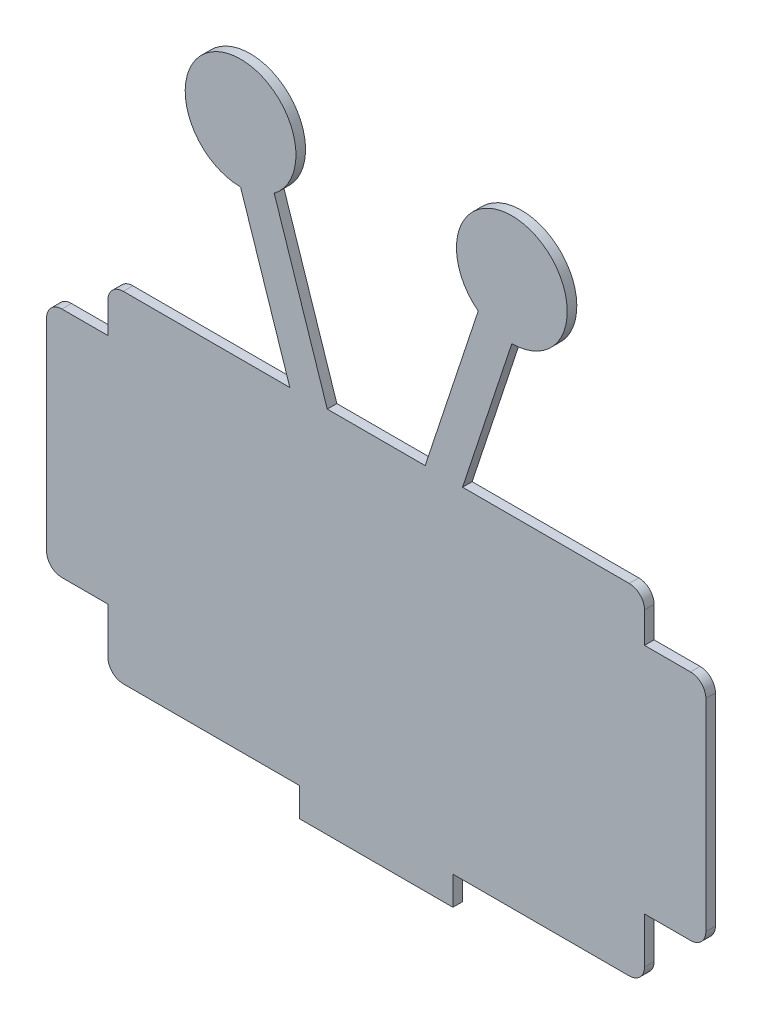
ISO-10303-21;
HEADER;
FILE_DESCRIPTION(('STEP AP214'),'2;1');
FILE_NAME('part.step','',(''),(''),'','','');
FILE_SCHEMA(('AUTOMOTIVE_DESIGN { 1 0 10303 214 1 1 1 1 }'));
ENDSEC;
DATA;
#1=APPLICATION_CONTEXT('core data for automotive mechanical design processes');
#2=APPLICATION_PROTOCOL_DEFINITION('international standard','automotive_design',2000,#1);
#3=PRODUCT_CONTEXT('',#1,'mechanical');
#4=PRODUCT('Part','Part','',(#3));
#5=PRODUCT_RELATED_PRODUCT_CATEGORY('part','',(#4));
#6=PRODUCT_DEFINITION_FORMATION('','',#4);
#7=PRODUCT_DEFINITION_CONTEXT('part definition',#1,'design');
#8=PRODUCT_DEFINITION('design','',#6,#7);
#9=PRODUCT_DEFINITION_SHAPE('','',#8);
#10=(LENGTH_UNIT() NAMED_UNIT(*) SI_UNIT(.MILLI.,.METRE.));
#11=(NAMED_UNIT(*) PLANE_ANGLE_UNIT() SI_UNIT($,.RADIAN.));
#12=(NAMED_UNIT(*) SI_UNIT($,.STERADIAN.) SOLID_ANGLE_UNIT());
#13=UNCERTAINTY_MEASURE_WITH_UNIT(LENGTH_MEASURE(1.E-05),#10,'distance_accuracy_value','');
#14=(GEOMETRIC_REPRESENTATION_CONTEXT(3) GLOBAL_UNCERTAINTY_ASSIGNED_CONTEXT((#13)) GLOBAL_UNIT_ASSIGNED_CONTEXT((#10,
#11,#12)) REPRESENTATION_CONTEXT('',''));
#15=CARTESIAN_POINT('',(0.,0.,0.));
#16=DIRECTION('',(0.,0.,1.));
#17=DIRECTION('',(1.,0.,0.));
#18=AXIS2_PLACEMENT_3D('',#15,#16,#17);
#19=CARTESIAN_POINT('',(-5.08,15.24,3.175));
#20=DIRECTION('',(0.,1.,0.));
#21=DIRECTION('',(-1.,0.,0.));
#22=AXIS2_PLACEMENT_3D('',#19,#20,#21);
#23=PLANE('',#22);
#24=DIRECTION('',(1.,0.,0.));
#25=VECTOR('',#24,1.);
#26=CARTESIAN_POINT('',(-5.08,15.24,0.));
#27=LINE('',#26,#25);
#28=CARTESIAN_POINT('',(-20.32,15.24,0.));
#29=VERTEX_POINT('',#28);
#30=CARTESIAN_POINT('',(-5.08,15.24,0.));
#31=VERTEX_POINT('',#30);
#32=EDGE_CURVE('E284',#29,#31,#27,.T.);
#33=ORIENTED_EDGE('',*,*,#32,.T.);
#34=DIRECTION('',(0.,0.,-1.));
#35=VECTOR('',#34,1.);
#36=CARTESIAN_POINT('',(-5.08,15.24,3.175));
#37=LINE('',#36,#35);
#38=CARTESIAN_POINT('',(-5.08,15.24,3.175));
#39=VERTEX_POINT('',#38);
#40=EDGE_CURVE('E11',#39,#31,#37,.T.);
#41=ORIENTED_EDGE('',*,*,#40,.F.);
#42=DIRECTION('',(1.,0.,0.));
#43=VECTOR('',#42,1.);
#44=CARTESIAN_POINT('',(-5.08,15.24,3.175));
#45=LINE('',#44,#43);
#46=CARTESIAN_POINT('',(-20.32,15.24,3.175));
#47=VERTEX_POINT('',#46);
#48=EDGE_CURVE('E378',#47,#39,#45,.T.);
#49=ORIENTED_EDGE('',*,*,#48,.F.);
#50=DIRECTION('',(0.,0.,-1.));
#51=VECTOR('',#50,1.);
#52=CARTESIAN_POINT('',(-20.32,15.24,3.175));
#53=LINE('',#52,#51);
#54=EDGE_CURVE('E280',#47,#29,#53,.T.);
#55=ORIENTED_EDGE('',*,*,#54,.T.);
#56=EDGE_LOOP('',(#33,#41,#49,#55));
#57=FACE_BOUND('',#56,.T.);
#58=ADVANCED_FACE('F39',(#57),#23,.F.);
#59=CARTESIAN_POINT('',(-5.08,0.,3.175));
#60=DIRECTION('',(1.,0.,0.));
#61=DIRECTION('',(0.,0.,-1.));
#62=AXIS2_PLACEMENT_3D('',#59,#60,#61);
#63=PLANE('',#62);
#64=DIRECTION('',(0.,-1.,0.));
#65=VECTOR('',#64,1.);
#66=CARTESIAN_POINT('',(-5.08,0.,0.));
#67=LINE('',#66,#65);
#68=CARTESIAN_POINT('',(-5.08,0.,0.));
#69=VERTEX_POINT('',#68);
#70=EDGE_CURVE('E288',#31,#69,#67,.T.);
#71=ORIENTED_EDGE('',*,*,#70,.T.);
#72=DIRECTION('',(0.,0.,-1.));
#73=VECTOR('',#72,1.);
#74=CARTESIAN_POINT('',(-5.08,0.,3.175));
#75=LINE('',#74,#73);
#76=CARTESIAN_POINT('',(-5.08,0.,3.175));
#77=VERTEX_POINT('',#76);
#78=EDGE_CURVE('E48',#77,#69,#75,.T.);
#79=ORIENTED_EDGE('',*,*,#78,.F.);
#80=DIRECTION('',(0.,-1.,0.));
#81=VECTOR('',#80,1.);
#82=CARTESIAN_POINT('',(-5.08,0.,3.175));
#83=LINE('',#82,#81);
#84=EDGE_CURVE('E171',#39,#77,#83,.T.);
#85=ORIENTED_EDGE('',*,*,#84,.F.);
#86=ORIENTED_EDGE('',*,*,#40,.T.);
#87=EDGE_LOOP('',(#71,#79,#85,#86));
#88=FACE_BOUND('',#87,.T.);
#89=ADVANCED_FACE('F612',(#88),#63,.F.);
#90=CARTESIAN_POINT('',(0.,0.,3.175));
#91=DIRECTION('',(0.,0.,-1.));
#92=DIRECTION('',(-1.,0.,0.));
#93=AXIS2_PLACEMENT_3D('',#90,#91,#92);
#94=CYLINDRICAL_SURFACE('',#93,5.08);
#95=CARTESIAN_POINT('',(0.,0.,0.));
#96=DIRECTION('',(0.,0.,1.));
#97=DIRECTION('',(-1.,0.,0.));
#98=AXIS2_PLACEMENT_3D('',#95,#96,#97);
#99=CIRCLE('',#98,5.08);
#100=CARTESIAN_POINT('',(0.,-5.08,0.));
#101=VERTEX_POINT('',#100);
#102=EDGE_CURVE('E291',#69,#101,#99,.T.);
#103=ORIENTED_EDGE('',*,*,#102,.T.);
#104=DIRECTION('',(0.,0.,-1.));
#105=VECTOR('',#104,1.);
#106=CARTESIAN_POINT('',(0.,-5.08,3.175));
#107=LINE('',#106,#105);
#108=CARTESIAN_POINT('',(0.,-5.08,3.175));
#109=VERTEX_POINT('',#108);
#110=EDGE_CURVE('E485',#109,#101,#107,.T.);
#111=ORIENTED_EDGE('',*,*,#110,.F.);
#112=CARTESIAN_POINT('',(0.,0.,3.175));
#113=DIRECTION('',(0.,0.,1.));
#114=DIRECTION('',(-1.,0.,0.));
#115=AXIS2_PLACEMENT_3D('',#112,#113,#114);
#116=CIRCLE('',#115,5.08);
#117=EDGE_CURVE('E495',#77,#109,#116,.T.);
#118=ORIENTED_EDGE('',*,*,#117,.F.);
#119=ORIENTED_EDGE('',*,*,#78,.T.);
#120=EDGE_LOOP('',(#103,#111,#118,#119));
#121=FACE_BOUND('',#120,.T.);
#122=ADVANCED_FACE('F493',(#121),#94,.T.);
#123=CARTESIAN_POINT('',(0.,-5.08,3.175));
#124=DIRECTION('',(0.,1.,0.));
#125=DIRECTION('',(0.,0.,1.));
#126=AXIS2_PLACEMENT_3D('',#123,#124,#125);
#127=PLANE('',#126);
#128=DIRECTION('',(1.,0.,0.));
#129=VECTOR('',#128,1.);
#130=CARTESIAN_POINT('',(0.,-5.08,0.));
#131=LINE('',#130,#129);
#132=CARTESIAN_POINT('',(58.42,-5.08,0.));
#133=VERTEX_POINT('',#132);
#134=EDGE_CURVE('E294',#101,#133,#131,.T.);
#135=ORIENTED_EDGE('',*,*,#134,.T.);
#136=DIRECTION('',(0.,0.,-1.));
#137=VECTOR('',#136,1.);
#138=CARTESIAN_POINT('',(58.42,-5.08,3.175));
#139=LINE('',#138,#137);
#140=CARTESIAN_POINT('',(58.42,-5.08,3.175));
#141=VERTEX_POINT('',#140);
#142=EDGE_CURVE('E481',#141,#133,#139,.T.);
#143=ORIENTED_EDGE('',*,*,#142,.F.);
#144=DIRECTION('',(1.,0.,0.));
#145=VECTOR('',#144,1.);
#146=CARTESIAN_POINT('',(0.,-5.08,3.175));
#147=LINE('',#146,#145);
#148=EDGE_CURVE('E514',#109,#141,#147,.T.);
#149=ORIENTED_EDGE('',*,*,#148,.F.);
#150=ORIENTED_EDGE('',*,*,#110,.T.);
#151=EDGE_LOOP('',(#135,#143,#149,#150));
#152=FACE_BOUND('',#151,.T.);
#153=ADVANCED_FACE('F504',(#152),#127,.F.);
#154=CARTESIAN_POINT('',(58.42,-5.08,3.175));
#155=DIRECTION('',(1.,0.,0.));
#156=DIRECTION('',(0.,0.,-1.));
#157=AXIS2_PLACEMENT_3D('',#154,#155,#156);
#158=PLANE('',#157);
#159=DIRECTION('',(0.,-1.,0.));
#160=VECTOR('',#159,1.);
#161=CARTESIAN_POINT('',(58.42,-5.08,0.));
#162=LINE('',#161,#160);
#163=CARTESIAN_POINT('',(58.42,-14.605,0.));
#164=VERTEX_POINT('',#163);
#165=EDGE_CURVE('E297',#133,#164,#162,.T.);
#166=ORIENTED_EDGE('',*,*,#165,.T.);
#167=DIRECTION('',(0.,0.,-1.));
#168=VECTOR('',#167,1.);
#169=CARTESIAN_POINT('',(58.42,-14.605,3.175));
#170=LINE('',#169,#168);
#171=CARTESIAN_POINT('',(58.42,-14.605,3.175));
#172=VERTEX_POINT('',#171);
#173=EDGE_CURVE('E477',#172,#164,#170,.T.);
#174=ORIENTED_EDGE('',*,*,#173,.F.);
#175=DIRECTION('',(0.,-1.,0.));
#176=VECTOR('',#175,1.);
#177=CARTESIAN_POINT('',(58.42,-5.08,3.175));
#178=LINE('',#177,#176);
#179=EDGE_CURVE('E510',#141,#172,#178,.T.);
#180=ORIENTED_EDGE('',*,*,#179,.F.);
#181=ORIENTED_EDGE('',*,*,#142,.T.);
#182=EDGE_LOOP('',(#166,#174,#180,#181));
#183=FACE_BOUND('',#182,.T.);
#184=ADVANCED_FACE('F508',(#183),#158,.F.);
#185=CARTESIAN_POINT('',(58.42,-14.605,3.175));
#186=DIRECTION('',(0.,1.,0.));
#187=DIRECTION('',(0.,0.,1.));
#188=AXIS2_PLACEMENT_3D('',#185,#186,#187);
#189=PLANE('',#188);
#190=DIRECTION('',(1.,0.,0.));
#191=VECTOR('',#190,1.);
#192=CARTESIAN_POINT('',(58.42,-14.605,0.));
#193=LINE('',#192,#191);
#194=CARTESIAN_POINT('',(109.22,-14.605,0.));
#195=VERTEX_POINT('',#194);
#196=EDGE_CURVE('E300',#164,#195,#193,.T.);
#197=ORIENTED_EDGE('',*,*,#196,.T.);
#198=DIRECTION('',(0.,0.,-1.));
#199=VECTOR('',#198,1.);
#200=CARTESIAN_POINT('',(109.22,-14.605,3.175));
#201=LINE('',#200,#199);
#202=CARTESIAN_POINT('',(109.22,-14.605,3.175));
#203=VERTEX_POINT('',#202);
#204=EDGE_CURVE('E473',#203,#195,#201,.T.);
#205=ORIENTED_EDGE('',*,*,#204,.F.);
#206=DIRECTION('',(1.,0.,0.));
#207=VECTOR('',#206,1.);
#208=CARTESIAN_POINT('',(58.42,-14.605,3.175));
#209=LINE('',#208,#207);
#210=EDGE_CURVE('E513',#172,#203,#209,.T.);
#211=ORIENTED_EDGE('',*,*,#210,.F.);
#212=ORIENTED_EDGE('',*,*,#173,.T.);
#213=EDGE_LOOP('',(#197,#205,#211,#212));
#214=FACE_BOUND('',#213,.T.);
#215=ADVANCED_FACE('F625',(#214),#189,.F.);
#216=CARTESIAN_POINT('',(109.22,-5.08,3.175));
#217=DIRECTION('',(-1.,0.,0.));
#218=DIRECTION('',(0.,0.,1.));
#219=AXIS2_PLACEMENT_3D('',#216,#217,#218);
#220=PLANE('',#219);
#221=DIRECTION('',(0.,1.,0.));
#222=VECTOR('',#221,1.);
#223=CARTESIAN_POINT('',(109.22,-5.08,0.));
#224=LINE('',#223,#222);
#225=CARTESIAN_POINT('',(109.22,-5.08,0.));
#226=VERTEX_POINT('',#225);
#227=EDGE_CURVE('E303',#195,#226,#224,.T.);
#228=ORIENTED_EDGE('',*,*,#227,.T.);
#229=DIRECTION('',(0.,0.,-1.));
#230=VECTOR('',#229,1.);
#231=CARTESIAN_POINT('',(109.22,-5.08,3.175));
#232=LINE('',#231,#230);
#233=CARTESIAN_POINT('',(109.22,-5.08,3.175));
#234=VERTEX_POINT('',#233);
#235=EDGE_CURVE('E469',#234,#226,#232,.T.);
#236=ORIENTED_EDGE('',*,*,#235,.F.);
#237=DIRECTION('',(0.,1.,0.));
#238=VECTOR('',#237,1.);
#239=CARTESIAN_POINT('',(109.22,-5.08,3.175));
#240=LINE('',#239,#238);
#241=EDGE_CURVE('E518',#203,#234,#240,.T.);
#242=ORIENTED_EDGE('',*,*,#241,.F.);
#243=ORIENTED_EDGE('',*,*,#204,.T.);
#244=EDGE_LOOP('',(#228,#236,#242,#243));
#245=FACE_BOUND('',#244,.T.);
#246=ADVANCED_FACE('F628',(#245),#220,.F.);
#247=CARTESIAN_POINT('',(109.22,-5.08,3.175));
#248=DIRECTION('',(0.,1.,0.));
#249=DIRECTION('',(0.,0.,1.));
#250=AXIS2_PLACEMENT_3D('',#247,#248,#249);
#251=PLANE('',#250);
#252=DIRECTION('',(1.,0.,0.));
#253=VECTOR('',#252,1.);
#254=CARTESIAN_POINT('',(109.22,-5.08,0.));
#255=LINE('',#254,#253);
#256=CARTESIAN_POINT('',(167.64,-5.08,0.));
#257=VERTEX_POINT('',#256);
#258=EDGE_CURVE('E306',#226,#257,#255,.T.);
#259=ORIENTED_EDGE('',*,*,#258,.T.);
#260=DIRECTION('',(0.,0.,-1.));
#261=VECTOR('',#260,1.);
#262=CARTESIAN_POINT('',(167.64,-5.08,3.175));
#263=LINE('',#262,#261);
#264=CARTESIAN_POINT('',(167.64,-5.08,3.175));
#265=VERTEX_POINT('',#264);
#266=EDGE_CURVE('E465',#265,#257,#263,.T.);
#267=ORIENTED_EDGE('',*,*,#266,.F.);
#268=DIRECTION('',(1.,0.,0.));
#269=VECTOR('',#268,1.);
#270=CARTESIAN_POINT('',(109.22,-5.08,3.175));
#271=LINE('',#270,#269);
#272=EDGE_CURVE('E525',#234,#265,#271,.T.);
#273=ORIENTED_EDGE('',*,*,#272,.F.);
#274=ORIENTED_EDGE('',*,*,#235,.T.);
#275=EDGE_LOOP('',(#259,#267,#273,#274));
#276=FACE_BOUND('',#275,.T.);
#277=ADVANCED_FACE('F632',(#276),#251,.F.);
#278=CARTESIAN_POINT('',(167.64,0.,3.175));
#279=DIRECTION('',(0.,0.,-1.));
#280=DIRECTION('',(-1.,0.,0.));
#281=AXIS2_PLACEMENT_3D('',#278,#279,#280);
#282=CYLINDRICAL_SURFACE('',#281,5.08);
#283=CARTESIAN_POINT('',(167.64,0.,0.));
#284=DIRECTION('',(0.,0.,1.));
#285=DIRECTION('',(1.,0.,0.));
#286=AXIS2_PLACEMENT_3D('',#283,#284,#285);
#287=CIRCLE('',#286,5.08);
#288=CARTESIAN_POINT('',(172.72,0.,0.));
#289=VERTEX_POINT('',#288);
#290=EDGE_CURVE('E309',#257,#289,#287,.T.);
#291=ORIENTED_EDGE('',*,*,#290,.T.);
#292=DIRECTION('',(0.,0.,-1.));
#293=VECTOR('',#292,1.);
#294=CARTESIAN_POINT('',(172.72,0.,3.175));
#295=LINE('',#294,#293);
#296=CARTESIAN_POINT('',(172.72,0.,3.175));
#297=VERTEX_POINT('',#296);
#298=EDGE_CURVE('E461',#297,#289,#295,.T.);
#299=ORIENTED_EDGE('',*,*,#298,.F.);
#300=CARTESIAN_POINT('',(167.64,0.,3.175));
#301=DIRECTION('',(0.,0.,1.));
#302=DIRECTION('',(1.,0.,0.));
#303=AXIS2_PLACEMENT_3D('',#300,#301,#302);
#304=CIRCLE('',#303,5.08);
#305=EDGE_CURVE('E528',#265,#297,#304,.T.);
#306=ORIENTED_EDGE('',*,*,#305,.F.);
#307=ORIENTED_EDGE('',*,*,#266,.T.);
#308=EDGE_LOOP('',(#291,#299,#306,#307));
#309=FACE_BOUND('',#308,.T.);
#310=ADVANCED_FACE('F636',(#309),#282,.T.);
#311=CARTESIAN_POINT('',(172.72,0.,3.175));
#312=DIRECTION('',(-1.,0.,0.));
#313=DIRECTION('',(0.,0.,1.));
#314=AXIS2_PLACEMENT_3D('',#311,#312,#313);
#315=PLANE('',#314);
#316=DIRECTION('',(0.,1.,0.));
#317=VECTOR('',#316,1.);
#318=CARTESIAN_POINT('',(172.72,0.,0.));
#319=LINE('',#318,#317);
#320=CARTESIAN_POINT('',(172.72,15.24,0.));
#321=VERTEX_POINT('',#320);
#322=EDGE_CURVE('E312',#289,#321,#319,.T.);
#323=ORIENTED_EDGE('',*,*,#322,.T.);
#324=DIRECTION('',(0.,0.,-1.));
#325=VECTOR('',#324,1.);
#326=CARTESIAN_POINT('',(172.72,15.24,3.175));
#327=LINE('',#326,#325);
#328=CARTESIAN_POINT('',(172.72,15.24,3.175));
#329=VERTEX_POINT('',#328);
#330=EDGE_CURVE('E457',#329,#321,#327,.T.);
#331=ORIENTED_EDGE('',*,*,#330,.F.);
#332=DIRECTION('',(0.,1.,0.));
#333=VECTOR('',#332,1.);
#334=CARTESIAN_POINT('',(172.72,0.,3.175));
#335=LINE('',#334,#333);
#336=EDGE_CURVE('E531',#297,#329,#335,.T.);
#337=ORIENTED_EDGE('',*,*,#336,.F.);
#338=ORIENTED_EDGE('',*,*,#298,.T.);
#339=EDGE_LOOP('',(#323,#331,#337,#338));
#340=FACE_BOUND('',#339,.T.);
#341=ADVANCED_FACE('F640',(#340),#315,.F.);
#342=CARTESIAN_POINT('',(172.72,15.24,3.175));
#343=DIRECTION('',(0.,1.,0.));
#344=DIRECTION('',(-1.,0.,0.));
#345=AXIS2_PLACEMENT_3D('',#342,#343,#344);
#346=PLANE('',#345);
#347=DIRECTION('',(1.,0.,0.));
#348=VECTOR('',#347,1.);
#349=CARTESIAN_POINT('',(172.72,15.24,0.));
#350=LINE('',#349,#348);
#351=CARTESIAN_POINT('',(187.96,15.24,0.));
#352=VERTEX_POINT('',#351);
#353=EDGE_CURVE('E315',#321,#352,#350,.T.);
#354=ORIENTED_EDGE('',*,*,#353,.T.);
#355=DIRECTION('',(0.,0.,-1.));
#356=VECTOR('',#355,1.);
#357=CARTESIAN_POINT('',(187.96,15.24,3.175));
#358=LINE('',#357,#356);
#359=CARTESIAN_POINT('',(187.96,15.24,3.175));
#360=VERTEX_POINT('',#359);
#361=EDGE_CURVE('E453',#360,#352,#358,.T.);
#362=ORIENTED_EDGE('',*,*,#361,.F.);
#363=DIRECTION('',(1.,0.,0.));
#364=VECTOR('',#363,1.);
#365=CARTESIAN_POINT('',(172.72,15.24,3.175));
#366=LINE('',#365,#364);
#367=EDGE_CURVE('E534',#329,#360,#366,.T.);
#368=ORIENTED_EDGE('',*,*,#367,.F.);
#369=ORIENTED_EDGE('',*,*,#330,.T.);
#370=EDGE_LOOP('',(#354,#362,#368,#369));
#371=FACE_BOUND('',#370,.T.);
#372=ADVANCED_FACE('F644',(#371),#346,.F.);
#373=CARTESIAN_POINT('',(187.96,20.32,3.175));
#374=DIRECTION('',(0.,0.,-1.));
#375=DIRECTION('',(-1.,0.,0.));
#376=AXIS2_PLACEMENT_3D('',#373,#374,#375);
#377=CYLINDRICAL_SURFACE('',#376,5.08);
#378=CARTESIAN_POINT('',(187.96,20.32,0.));
#379=DIRECTION('',(0.,0.,1.));
#380=DIRECTION('',(-1.,0.,0.));
#381=AXIS2_PLACEMENT_3D('',#378,#379,#380);
#382=CIRCLE('',#381,5.08);
#383=CARTESIAN_POINT('',(193.04,20.32,0.));
#384=VERTEX_POINT('',#383);
#385=EDGE_CURVE('E318',#352,#384,#382,.T.);
#386=ORIENTED_EDGE('',*,*,#385,.T.);
#387=DIRECTION('',(0.,0.,-1.));
#388=VECTOR('',#387,1.);
#389=CARTESIAN_POINT('',(193.04,20.32,3.175));
#390=LINE('',#389,#388);
#391=CARTESIAN_POINT('',(193.04,20.32,3.175));
#392=VERTEX_POINT('',#391);
#393=EDGE_CURVE('E449',#392,#384,#390,.T.);
#394=ORIENTED_EDGE('',*,*,#393,.F.);
#395=CARTESIAN_POINT('',(187.96,20.32,3.175));
#396=DIRECTION('',(0.,0.,1.));
#397=DIRECTION('',(-1.,0.,0.));
#398=AXIS2_PLACEMENT_3D('',#395,#396,#397);
#399=CIRCLE('',#398,5.08);
#400=EDGE_CURVE('E537',#360,#392,#399,.T.);
#401=ORIENTED_EDGE('',*,*,#400,.F.);
#402=ORIENTED_EDGE('',*,*,#361,.T.);
#403=EDGE_LOOP('',(#386,#394,#401,#402));
#404=FACE_BOUND('',#403,.T.);
#405=ADVANCED_FACE('F648',(#404),#377,.T.);
#406=CARTESIAN_POINT('',(193.04,20.32,3.175));
#407=DIRECTION('',(-1.,0.,0.));
#408=DIRECTION('',(0.,0.,1.));
#409=AXIS2_PLACEMENT_3D('',#406,#407,#408);
#410=PLANE('',#409);
#411=DIRECTION('',(0.,1.,0.));
#412=VECTOR('',#411,1.);
#413=CARTESIAN_POINT('',(193.04,20.32,0.));
#414=LINE('',#413,#412);
#415=CARTESIAN_POINT('',(193.04,87.2235999999999,0.));
#416=VERTEX_POINT('',#415);
#417=EDGE_CURVE('E321',#384,#416,#414,.T.);
#418=ORIENTED_EDGE('',*,*,#417,.T.);
#419=DIRECTION('',(0.,0.,-1.));
#420=VECTOR('',#419,1.);
#421=CARTESIAN_POINT('',(193.04,87.2235999999999,3.175));
#422=LINE('',#421,#420);
#423=CARTESIAN_POINT('',(193.04,87.2235999999999,3.175));
#424=VERTEX_POINT('',#423);
#425=EDGE_CURVE('E445',#424,#416,#422,.T.);
#426=ORIENTED_EDGE('',*,*,#425,.F.);
#427=DIRECTION('',(0.,1.,0.));
#428=VECTOR('',#427,1.);
#429=CARTESIAN_POINT('',(193.04,20.32,3.175));
#430=LINE('',#429,#428);
#431=EDGE_CURVE('E540',#392,#424,#430,.T.);
#432=ORIENTED_EDGE('',*,*,#431,.F.);
#433=ORIENTED_EDGE('',*,*,#393,.T.);
#434=EDGE_LOOP('',(#418,#426,#432,#433));
#435=FACE_BOUND('',#434,.T.);
#436=ADVANCED_FACE('F652',(#435),#410,.F.);
#437=CARTESIAN_POINT('',(187.96,87.2235999999999,3.175));
#438=DIRECTION('',(0.,0.,-1.));
#439=DIRECTION('',(-1.,0.,0.));
#440=AXIS2_PLACEMENT_3D('',#437,#438,#439);
#441=CYLINDRICAL_SURFACE('',#440,5.07999999999999);
#442=CARTESIAN_POINT('',(187.96,87.2235999999999,0.));
#443=DIRECTION('',(0.,0.,1.));
#444=DIRECTION('',(-1.,0.,0.));
#445=AXIS2_PLACEMENT_3D('',#442,#443,#444);
#446=CIRCLE('',#445,5.07999999999999);
#447=CARTESIAN_POINT('',(187.96,92.3035999999999,0.));
#448=VERTEX_POINT('',#447);
#449=EDGE_CURVE('E324',#416,#448,#446,.T.);
#450=ORIENTED_EDGE('',*,*,#449,.T.);
#451=DIRECTION('',(0.,0.,-1.));
#452=VECTOR('',#451,1.);
#453=CARTESIAN_POINT('',(187.96,92.3035999999999,3.175));
#454=LINE('',#453,#452);
#455=CARTESIAN_POINT('',(187.96,92.3035999999999,3.175));
#456=VERTEX_POINT('',#455);
#457=EDGE_CURVE('E441',#456,#448,#454,.T.);
#458=ORIENTED_EDGE('',*,*,#457,.F.);
#459=CARTESIAN_POINT('',(187.96,87.2235999999999,3.175));
#460=DIRECTION('',(0.,0.,1.));
#461=DIRECTION('',(-1.,0.,0.));
#462=AXIS2_PLACEMENT_3D('',#459,#460,#461);
#463=CIRCLE('',#462,5.07999999999999);
#464=EDGE_CURVE('E543',#424,#456,#463,.T.);
#465=ORIENTED_EDGE('',*,*,#464,.F.);
#466=ORIENTED_EDGE('',*,*,#425,.T.);
#467=EDGE_LOOP('',(#450,#458,#465,#466));
#468=FACE_BOUND('',#467,.T.);
#469=ADVANCED_FACE('F656',(#468),#441,.T.);
#470=CARTESIAN_POINT('',(172.72,92.3035999999999,3.175));
#471=DIRECTION('',(0.,-1.,0.));
#472=DIRECTION('',(1.,0.,0.));
#473=AXIS2_PLACEMENT_3D('',#470,#471,#472);
#474=PLANE('',#473);
#475=DIRECTION('',(-1.,0.,0.));
#476=VECTOR('',#475,1.);
#477=CARTESIAN_POINT('',(172.72,92.3035999999999,0.));
#478=LINE('',#477,#476);
#479=CARTESIAN_POINT('',(172.72,92.3035999999999,0.));
#480=VERTEX_POINT('',#479);
#481=EDGE_CURVE('E327',#448,#480,#478,.T.);
#482=ORIENTED_EDGE('',*,*,#481,.T.);
#483=DIRECTION('',(0.,0.,-1.));
#484=VECTOR('',#483,1.);
#485=CARTESIAN_POINT('',(172.72,92.3035999999999,3.175));
#486=LINE('',#485,#484);
#487=CARTESIAN_POINT('',(172.72,92.3035999999999,3.175));
#488=VERTEX_POINT('',#487);
#489=EDGE_CURVE('E437',#488,#480,#486,.T.);
#490=ORIENTED_EDGE('',*,*,#489,.F.);
#491=DIRECTION('',(-1.,0.,0.));
#492=VECTOR('',#491,1.);
#493=CARTESIAN_POINT('',(172.72,92.3035999999999,3.175));
#494=LINE('',#493,#492);
#495=EDGE_CURVE('E546',#456,#488,#494,.T.);
#496=ORIENTED_EDGE('',*,*,#495,.F.);
#497=ORIENTED_EDGE('',*,*,#457,.T.);
#498=EDGE_LOOP('',(#482,#490,#496,#497));
#499=FACE_BOUND('',#498,.T.);
#500=ADVANCED_FACE('F660',(#499),#474,.F.);
#501=CARTESIAN_POINT('',(172.72,92.3035999999999,3.175));
#502=DIRECTION('',(-1.,0.,0.));
#503=DIRECTION('',(0.,0.,1.));
#504=AXIS2_PLACEMENT_3D('',#501,#502,#503);
#505=PLANE('',#504);
#506=DIRECTION('',(0.,1.,0.));
#507=VECTOR('',#506,1.);
#508=CARTESIAN_POINT('',(172.72,92.3035999999999,0.));
#509=LINE('',#508,#507);
#510=CARTESIAN_POINT('',(172.72,102.4636,0.));
#511=VERTEX_POINT('',#510);
#512=EDGE_CURVE('E330',#480,#511,#509,.T.);
#513=ORIENTED_EDGE('',*,*,#512,.T.);
#514=DIRECTION('',(0.,0.,-1.));
#515=VECTOR('',#514,1.);
#516=CARTESIAN_POINT('',(172.72,102.4636,3.175));
#517=LINE('',#516,#515);
#518=CARTESIAN_POINT('',(172.72,102.4636,3.175));
#519=VERTEX_POINT('',#518);
#520=EDGE_CURVE('E433',#519,#511,#517,.T.);
#521=ORIENTED_EDGE('',*,*,#520,.F.);
#522=DIRECTION('',(0.,1.,0.));
#523=VECTOR('',#522,1.);
#524=CARTESIAN_POINT('',(172.72,92.3035999999999,3.175));
#525=LINE('',#524,#523);
#526=EDGE_CURVE('E549',#488,#519,#525,.T.);
#527=ORIENTED_EDGE('',*,*,#526,.F.);
#528=ORIENTED_EDGE('',*,*,#489,.T.);
#529=EDGE_LOOP('',(#513,#521,#527,#528));
#530=FACE_BOUND('',#529,.T.);
#531=ADVANCED_FACE('F664',(#530),#505,.F.);
#532=CARTESIAN_POINT('',(167.64,102.4636,3.175));
#533=DIRECTION('',(0.,0.,-1.));
#534=DIRECTION('',(-1.,0.,0.));
#535=AXIS2_PLACEMENT_3D('',#532,#533,#534);
#536=CYLINDRICAL_SURFACE('',#535,5.08);
#537=CARTESIAN_POINT('',(167.64,102.4636,0.));
#538=DIRECTION('',(0.,0.,1.));
#539=DIRECTION('',(-1.,0.,0.));
#540=AXIS2_PLACEMENT_3D('',#537,#538,#539);
#541=CIRCLE('',#540,5.08);
#542=CARTESIAN_POINT('',(167.64,107.5436,0.));
#543=VERTEX_POINT('',#542);
#544=EDGE_CURVE('E333',#511,#543,#541,.T.);
#545=ORIENTED_EDGE('',*,*,#544,.T.);
#546=DIRECTION('',(0.,0.,-1.));
#547=VECTOR('',#546,1.);
#548=CARTESIAN_POINT('',(167.64,107.5436,3.175));
#549=LINE('',#548,#547);
#550=CARTESIAN_POINT('',(167.64,107.5436,3.175));
#551=VERTEX_POINT('',#550);
#552=EDGE_CURVE('E429',#551,#543,#549,.T.);
#553=ORIENTED_EDGE('',*,*,#552,.F.);
#554=CARTESIAN_POINT('',(167.64,102.4636,3.175));
#555=DIRECTION('',(0.,0.,1.));
#556=DIRECTION('',(-1.,0.,0.));
#557=AXIS2_PLACEMENT_3D('',#554,#555,#556);
#558=CIRCLE('',#557,5.08);
#559=EDGE_CURVE('E552',#519,#551,#558,.T.);
#560=ORIENTED_EDGE('',*,*,#559,.F.);
#561=ORIENTED_EDGE('',*,*,#520,.T.);
#562=EDGE_LOOP('',(#545,#553,#560,#561));
#563=FACE_BOUND('',#562,.T.);
#564=ADVANCED_FACE('F668',(#563),#536,.T.);
#565=CARTESIAN_POINT('',(112.428072162847,107.5436,3.175));
#566=DIRECTION('',(0.,-1.,0.));
#567=DIRECTION('',(1.,0.,0.));
#568=AXIS2_PLACEMENT_3D('',#565,#566,#567);
#569=PLANE('',#568);
#570=DIRECTION('',(-1.,0.,0.));
#571=VECTOR('',#570,1.);
#572=CARTESIAN_POINT('',(112.428072162847,107.5436,0.));
#573=LINE('',#572,#571);
#574=CARTESIAN_POINT('',(112.428072162847,107.5436,0.));
#575=VERTEX_POINT('',#574);
#576=EDGE_CURVE('E336',#543,#575,#573,.T.);
#577=ORIENTED_EDGE('',*,*,#576,.T.);
#578=DIRECTION('',(0.,0.,-1.));
#579=VECTOR('',#578,1.);
#580=CARTESIAN_POINT('',(112.428072162847,107.5436,3.175));
#581=LINE('',#580,#579);
#582=CARTESIAN_POINT('',(112.428072162847,107.5436,3.175));
#583=VERTEX_POINT('',#582);
#584=EDGE_CURVE('E425',#583,#575,#581,.T.);
#585=ORIENTED_EDGE('',*,*,#584,.F.);
#586=DIRECTION('',(-1.,0.,0.));
#587=VECTOR('',#586,1.);
#588=CARTESIAN_POINT('',(112.428072162847,107.5436,3.175));
#589=LINE('',#588,#587);
#590=EDGE_CURVE('E555',#551,#583,#589,.T.);
#591=ORIENTED_EDGE('',*,*,#590,.F.);
#592=ORIENTED_EDGE('',*,*,#552,.T.);
#593=EDGE_LOOP('',(#577,#585,#591,#592));
#594=FACE_BOUND('',#593,.T.);
#595=ADVANCED_FACE('F672',(#594),#569,.F.);
#596=CARTESIAN_POINT('',(112.428072162847,107.5436,3.175));
#597=DIRECTION('',(-0.949392381169607,0.314092512768298,0.));
#598=DIRECTION('',(-0.314092512768299,-0.949392381169607,0.));
#599=AXIS2_PLACEMENT_3D('',#596,#597,#598);
#600=PLANE('',#599);
#601=DIRECTION('',(0.314092512768299,0.949392381169607,0.));
#602=VECTOR('',#601,1.);
#603=CARTESIAN_POINT('',(112.428072162847,107.5436,0.));
#604=LINE('',#603,#602);
#605=CARTESIAN_POINT('',(128.760921921537,156.912121990611,0.));
#606=VERTEX_POINT('',#605);
#607=EDGE_CURVE('E339',#575,#606,#604,.T.);
#608=ORIENTED_EDGE('',*,*,#607,.T.);
#609=DIRECTION('',(0.,0.,-1.));
#610=VECTOR('',#609,1.);
#611=CARTESIAN_POINT('',(128.760921921537,156.912121990611,3.175));
#612=LINE('',#611,#610);
#613=CARTESIAN_POINT('',(128.760921921537,156.912121990611,3.175));
#614=VERTEX_POINT('',#613);
#615=EDGE_CURVE('E421',#614,#606,#612,.T.);
#616=ORIENTED_EDGE('',*,*,#615,.F.);
#617=DIRECTION('',(0.314092512768299,0.949392381169607,0.));
#618=VECTOR('',#617,1.);
#619=CARTESIAN_POINT('',(112.428072162847,107.5436,3.175));
#620=LINE('',#619,#618);
#621=EDGE_CURVE('E558',#583,#614,#620,.T.);
#622=ORIENTED_EDGE('',*,*,#621,.F.);
#623=ORIENTED_EDGE('',*,*,#584,.T.);
#624=EDGE_LOOP('',(#608,#616,#622,#623));
#625=FACE_BOUND('',#624,.T.);
#626=ADVANCED_FACE('F676',(#625),#600,.F.);
#627=CARTESIAN_POINT('',(128.760921921537,175.262755436898,3.175));
#628=DIRECTION('',(0.,0.,-1.));
#629=DIRECTION('',(-1.,0.,0.));
#630=AXIS2_PLACEMENT_3D('',#627,#628,#629);
#631=CYLINDRICAL_SURFACE('',#630,18.3506334462866);
#632=CARTESIAN_POINT('',(128.760921921537,175.262755436898,0.));
#633=DIRECTION('',(0.,0.,1.));
#634=DIRECTION('',(-1.,0.,0.));
#635=AXIS2_PLACEMENT_3D('',#632,#633,#634);
#636=CIRCLE('',#635,18.3506334462866);
#637=CARTESIAN_POINT('',(117.613615034572,160.685948617577,0.));
#638=VERTEX_POINT('',#637);
#639=EDGE_CURVE('E342',#606,#638,#636,.T.);
#640=ORIENTED_EDGE('',*,*,#639,.T.);
#641=DIRECTION('',(0.,0.,-1.));
#642=VECTOR('',#641,1.);
#643=CARTESIAN_POINT('',(117.613615034572,160.685948617577,3.175));
#644=LINE('',#643,#642);
#645=CARTESIAN_POINT('',(117.613615034572,160.685948617577,3.175));
#646=VERTEX_POINT('',#645);
#647=EDGE_CURVE('E417',#646,#638,#644,.T.);
#648=ORIENTED_EDGE('',*,*,#647,.F.);
#649=CARTESIAN_POINT('',(128.760921921537,175.262755436898,3.175));
#650=DIRECTION('',(0.,0.,1.));
#651=DIRECTION('',(-1.,0.,0.));
#652=AXIS2_PLACEMENT_3D('',#649,#650,#651);
#653=CIRCLE('',#652,18.3506334462866);
#654=EDGE_CURVE('E561',#614,#646,#653,.T.);
#655=ORIENTED_EDGE('',*,*,#654,.F.);
#656=ORIENTED_EDGE('',*,*,#615,.T.);
#657=EDGE_LOOP('',(#640,#648,#655,#656));
#658=FACE_BOUND('',#657,.T.);
#659=ADVANCED_FACE('F680',(#658),#631,.T.);
#660=CARTESIAN_POINT('',(100.032250213485,107.5436,3.175));
#661=DIRECTION('',(0.949392381169607,-0.314092512768298,0.));
#662=DIRECTION('',(0.314092512768299,0.949392381169607,0.));
#663=AXIS2_PLACEMENT_3D('',#660,#661,#662);
#664=PLANE('',#663);
#665=DIRECTION('',(-0.314092512768299,-0.949392381169607,0.));
#666=VECTOR('',#665,1.);
#667=CARTESIAN_POINT('',(100.032250213485,107.5436,0.));
#668=LINE('',#667,#666);
#669=CARTESIAN_POINT('',(100.032250213485,107.5436,0.));
#670=VERTEX_POINT('',#669);
#671=EDGE_CURVE('E345',#638,#670,#668,.T.);
#672=ORIENTED_EDGE('',*,*,#671,.T.);
#673=DIRECTION('',(0.,0.,-1.));
#674=VECTOR('',#673,1.);
#675=CARTESIAN_POINT('',(100.032250213485,107.5436,3.175));
#676=LINE('',#675,#674);
#677=CARTESIAN_POINT('',(100.032250213485,107.5436,3.175));
#678=VERTEX_POINT('',#677);
#679=EDGE_CURVE('E413',#678,#670,#676,.T.);
#680=ORIENTED_EDGE('',*,*,#679,.F.);
#681=DIRECTION('',(-0.314092512768299,-0.949392381169607,0.));
#682=VECTOR('',#681,1.);
#683=CARTESIAN_POINT('',(100.032250213485,107.5436,3.175));
#684=LINE('',#683,#682);
#685=EDGE_CURVE('E564',#646,#678,#684,.T.);
#686=ORIENTED_EDGE('',*,*,#685,.F.);
#687=ORIENTED_EDGE('',*,*,#647,.T.);
#688=EDGE_LOOP('',(#672,#680,#686,#687));
#689=FACE_BOUND('',#688,.T.);
#690=ADVANCED_FACE('F684',(#689),#664,.F.);
#691=CARTESIAN_POINT('',(67.6077497865152,107.5436,3.175));
#692=DIRECTION('',(0.,-1.,0.));
#693=DIRECTION('',(1.,0.,0.));
#694=AXIS2_PLACEMENT_3D('',#691,#692,#693);
#695=PLANE('',#694);
#696=DIRECTION('',(-1.,0.,0.));
#697=VECTOR('',#696,1.);
#698=CARTESIAN_POINT('',(67.6077497865152,107.5436,0.));
#699=LINE('',#698,#697);
#700=CARTESIAN_POINT('',(67.6077497865152,107.5436,0.));
#701=VERTEX_POINT('',#700);
#702=EDGE_CURVE('E348',#670,#701,#699,.T.);
#703=ORIENTED_EDGE('',*,*,#702,.T.);
#704=DIRECTION('',(0.,0.,-1.));
#705=VECTOR('',#704,1.);
#706=CARTESIAN_POINT('',(67.6077497865152,107.5436,3.175));
#707=LINE('',#706,#705);
#708=CARTESIAN_POINT('',(67.6077497865152,107.5436,3.175));
#709=VERTEX_POINT('',#708);
#710=EDGE_CURVE('E409',#709,#701,#707,.T.);
#711=ORIENTED_EDGE('',*,*,#710,.F.);
#712=DIRECTION('',(-1.,0.,0.));
#713=VECTOR('',#712,1.);
#714=CARTESIAN_POINT('',(67.6077497865152,107.5436,3.175));
#715=LINE('',#714,#713);
#716=EDGE_CURVE('E567',#678,#709,#715,.T.);
#717=ORIENTED_EDGE('',*,*,#716,.F.);
#718=ORIENTED_EDGE('',*,*,#679,.T.);
#719=EDGE_LOOP('',(#703,#711,#717,#718));
#720=FACE_BOUND('',#719,.T.);
#721=ADVANCED_FACE('F688',(#720),#695,.F.);
#722=CARTESIAN_POINT('',(67.6077497865152,107.5436,3.175));
#723=DIRECTION('',(-0.949392381169607,-0.314092512768298,0.));
#724=DIRECTION('',(0.314092512768298,-0.949392381169607,0.));
#725=AXIS2_PLACEMENT_3D('',#722,#723,#724);
#726=PLANE('',#725);
#727=DIRECTION('',(-0.314092512768298,0.949392381169607,0.));
#728=VECTOR('',#727,1.);
#729=CARTESIAN_POINT('',(67.6077497865152,107.5436,0.));
#730=LINE('',#729,#728);
#731=CARTESIAN_POINT('',(50.0263849654278,160.685948617577,0.));
#732=VERTEX_POINT('',#731);
#733=EDGE_CURVE('E351',#701,#732,#730,.T.);
#734=ORIENTED_EDGE('',*,*,#733,.T.);
#735=DIRECTION('',(0.,0.,-1.));
#736=VECTOR('',#735,1.);
#737=CARTESIAN_POINT('',(50.0263849654278,160.685948617577,3.175));
#738=LINE('',#737,#736);
#739=CARTESIAN_POINT('',(50.0263849654278,160.685948617577,3.175));
#740=VERTEX_POINT('',#739);
#741=EDGE_CURVE('E405',#740,#732,#738,.T.);
#742=ORIENTED_EDGE('',*,*,#741,.F.);
#743=DIRECTION('',(-0.314092512768298,0.949392381169607,0.));
#744=VECTOR('',#743,1.);
#745=CARTESIAN_POINT('',(67.6077497865152,107.5436,3.175));
#746=LINE('',#745,#744);
#747=EDGE_CURVE('E570',#709,#740,#746,.T.);
#748=ORIENTED_EDGE('',*,*,#747,.F.);
#749=ORIENTED_EDGE('',*,*,#710,.T.);
#750=EDGE_LOOP('',(#734,#742,#748,#749));
#751=FACE_BOUND('',#750,.T.);
#752=ADVANCED_FACE('F692',(#751),#726,.F.);
#753=CARTESIAN_POINT('',(38.879078078463,175.262755436898,3.175));
#754=DIRECTION('',(0.,0.,-1.));
#755=DIRECTION('',(-1.,0.,0.));
#756=AXIS2_PLACEMENT_3D('',#753,#754,#755);
#757=CYLINDRICAL_SURFACE('',#756,18.3506334462866);
#758=CARTESIAN_POINT('',(38.879078078463,175.262755436898,0.));
#759=DIRECTION('',(0.,0.,1.));
#760=DIRECTION('',(1.,0.,0.));
#761=AXIS2_PLACEMENT_3D('',#758,#759,#760);
#762=CIRCLE('',#761,18.3506334462866);
#763=CARTESIAN_POINT('',(38.879078078463,156.912121990612,0.));
#764=VERTEX_POINT('',#763);
#765=EDGE_CURVE('E354',#732,#764,#762,.T.);
#766=ORIENTED_EDGE('',*,*,#765,.T.);
#767=DIRECTION('',(0.,0.,-1.));
#768=VECTOR('',#767,1.);
#769=CARTESIAN_POINT('',(38.879078078463,156.912121990612,3.175));
#770=LINE('',#769,#768);
#771=CARTESIAN_POINT('',(38.879078078463,156.912121990612,3.175));
#772=VERTEX_POINT('',#771);
#773=EDGE_CURVE('E401',#772,#764,#770,.T.);
#774=ORIENTED_EDGE('',*,*,#773,.F.);
#775=CARTESIAN_POINT('',(38.879078078463,175.262755436898,3.175));
#776=DIRECTION('',(0.,0.,1.));
#777=DIRECTION('',(1.,0.,0.));
#778=AXIS2_PLACEMENT_3D('',#775,#776,#777);
#779=CIRCLE('',#778,18.3506334462866);
#780=EDGE_CURVE('E573',#740,#772,#779,.T.);
#781=ORIENTED_EDGE('',*,*,#780,.F.);
#782=ORIENTED_EDGE('',*,*,#741,.T.);
#783=EDGE_LOOP('',(#766,#774,#781,#782));
#784=FACE_BOUND('',#783,.T.);
#785=ADVANCED_FACE('F696',(#784),#757,.T.);
#786=CARTESIAN_POINT('',(55.2119278371531,107.5436,3.175));
#787=DIRECTION('',(0.949392381169607,0.314092512768298,0.));
#788=DIRECTION('',(-0.314092512768298,0.949392381169607,0.));
#789=AXIS2_PLACEMENT_3D('',#786,#787,#788);
#790=PLANE('',#789);
#791=DIRECTION('',(0.314092512768298,-0.949392381169607,0.));
#792=VECTOR('',#791,1.);
#793=CARTESIAN_POINT('',(55.2119278371531,107.5436,0.));
#794=LINE('',#793,#792);
#795=CARTESIAN_POINT('',(55.2119278371531,107.5436,0.));
#796=VERTEX_POINT('',#795);
#797=EDGE_CURVE('E357',#764,#796,#794,.T.);
#798=ORIENTED_EDGE('',*,*,#797,.T.);
#799=DIRECTION('',(0.,0.,-1.));
#800=VECTOR('',#799,1.);
#801=CARTESIAN_POINT('',(55.2119278371531,107.5436,3.175));
#802=LINE('',#801,#800);
#803=CARTESIAN_POINT('',(55.2119278371531,107.5436,3.175));
#804=VERTEX_POINT('',#803);
#805=EDGE_CURVE('E397',#804,#796,#802,.T.);
#806=ORIENTED_EDGE('',*,*,#805,.F.);
#807=DIRECTION('',(0.314092512768298,-0.949392381169607,0.));
#808=VECTOR('',#807,1.);
#809=CARTESIAN_POINT('',(55.2119278371531,107.5436,3.175));
#810=LINE('',#809,#808);
#811=EDGE_CURVE('E576',#772,#804,#810,.T.);
#812=ORIENTED_EDGE('',*,*,#811,.F.);
#813=ORIENTED_EDGE('',*,*,#773,.T.);
#814=EDGE_LOOP('',(#798,#806,#812,#813));
#815=FACE_BOUND('',#814,.T.);
#816=ADVANCED_FACE('F700',(#815),#790,.F.);
#817=CARTESIAN_POINT('',(0.,107.5436,3.175));
#818=DIRECTION('',(0.,-1.,0.));
#819=DIRECTION('',(0.,0.,-1.));
#820=AXIS2_PLACEMENT_3D('',#817,#818,#819);
#821=PLANE('',#820);
#822=DIRECTION('',(-1.,0.,0.));
#823=VECTOR('',#822,1.);
#824=CARTESIAN_POINT('',(0.,107.5436,0.));
#825=LINE('',#824,#823);
#826=CARTESIAN_POINT('',(0.,107.5436,0.));
#827=VERTEX_POINT('',#826);
#828=EDGE_CURVE('E360',#796,#827,#825,.T.);
#829=ORIENTED_EDGE('',*,*,#828,.T.);
#830=DIRECTION('',(0.,0.,-1.));
#831=VECTOR('',#830,1.);
#832=CARTESIAN_POINT('',(0.,107.5436,3.175));
#833=LINE('',#832,#831);
#834=CARTESIAN_POINT('',(0.,107.5436,3.175));
#835=VERTEX_POINT('',#834);
#836=EDGE_CURVE('E393',#835,#827,#833,.T.);
#837=ORIENTED_EDGE('',*,*,#836,.F.);
#838=DIRECTION('',(-1.,0.,0.));
#839=VECTOR('',#838,1.);
#840=CARTESIAN_POINT('',(0.,107.5436,3.175));
#841=LINE('',#840,#839);
#842=EDGE_CURVE('E579',#804,#835,#841,.T.);
#843=ORIENTED_EDGE('',*,*,#842,.F.);
#844=ORIENTED_EDGE('',*,*,#805,.T.);
#845=EDGE_LOOP('',(#829,#837,#843,#844));
#846=FACE_BOUND('',#845,.T.);
#847=ADVANCED_FACE('F704',(#846),#821,.F.);
#848=CARTESIAN_POINT('',(0.,102.4636,3.175));
#849=DIRECTION('',(0.,0.,-1.));
#850=DIRECTION('',(-1.,0.,0.));
#851=AXIS2_PLACEMENT_3D('',#848,#849,#850);
#852=CYLINDRICAL_SURFACE('',#851,5.08);
#853=CARTESIAN_POINT('',(0.,102.4636,0.));
#854=DIRECTION('',(0.,0.,1.));
#855=DIRECTION('',(1.,0.,0.));
#856=AXIS2_PLACEMENT_3D('',#853,#854,#855);
#857=CIRCLE('',#856,5.08);
#858=CARTESIAN_POINT('',(-5.08,102.4636,0.));
#859=VERTEX_POINT('',#858);
#860=EDGE_CURVE('E363',#827,#859,#857,.T.);
#861=ORIENTED_EDGE('',*,*,#860,.T.);
#862=DIRECTION('',(0.,0.,-1.));
#863=VECTOR('',#862,1.);
#864=CARTESIAN_POINT('',(-5.08,102.4636,3.175));
#865=LINE('',#864,#863);
#866=CARTESIAN_POINT('',(-5.08,102.4636,3.175));
#867=VERTEX_POINT('',#866);
#868=EDGE_CURVE('E389',#867,#859,#865,.T.);
#869=ORIENTED_EDGE('',*,*,#868,.F.);
#870=CARTESIAN_POINT('',(0.,102.4636,3.175));
#871=DIRECTION('',(0.,0.,1.));
#872=DIRECTION('',(1.,0.,0.));
#873=AXIS2_PLACEMENT_3D('',#870,#871,#872);
#874=CIRCLE('',#873,5.08);
#875=EDGE_CURVE('E582',#835,#867,#874,.T.);
#876=ORIENTED_EDGE('',*,*,#875,.F.);
#877=ORIENTED_EDGE('',*,*,#836,.T.);
#878=EDGE_LOOP('',(#861,#869,#876,#877));
#879=FACE_BOUND('',#878,.T.);
#880=ADVANCED_FACE('F708',(#879),#852,.T.);
#881=CARTESIAN_POINT('',(-5.08,92.3036,3.175));
#882=DIRECTION('',(1.,0.,0.));
#883=DIRECTION('',(0.,0.,-1.));
#884=AXIS2_PLACEMENT_3D('',#881,#882,#883);
#885=PLANE('',#884);
#886=DIRECTION('',(0.,-1.,0.));
#887=VECTOR('',#886,1.);
#888=CARTESIAN_POINT('',(-5.08,92.3036,0.));
#889=LINE('',#888,#887);
#890=CARTESIAN_POINT('',(-5.08,92.3036,0.));
#891=VERTEX_POINT('',#890);
#892=EDGE_CURVE('E366',#859,#891,#889,.T.);
#893=ORIENTED_EDGE('',*,*,#892,.T.);
#894=DIRECTION('',(0.,0.,-1.));
#895=VECTOR('',#894,1.);
#896=CARTESIAN_POINT('',(-5.08,92.3036,3.175));
#897=LINE('',#896,#895);
#898=CARTESIAN_POINT('',(-5.08,92.3036,3.175));
#899=VERTEX_POINT('',#898);
#900=EDGE_CURVE('E385',#899,#891,#897,.T.);
#901=ORIENTED_EDGE('',*,*,#900,.F.);
#902=DIRECTION('',(0.,-1.,0.));
#903=VECTOR('',#902,1.);
#904=CARTESIAN_POINT('',(-5.08,92.3036,3.175));
#905=LINE('',#904,#903);
#906=EDGE_CURVE('E585',#867,#899,#905,.T.);
#907=ORIENTED_EDGE('',*,*,#906,.F.);
#908=ORIENTED_EDGE('',*,*,#868,.T.);
#909=EDGE_LOOP('',(#893,#901,#907,#908));
#910=FACE_BOUND('',#909,.T.);
#911=ADVANCED_FACE('F593',(#910),#885,.F.);
#912=CARTESIAN_POINT('',(-5.08,92.3036,3.175));
#913=DIRECTION('',(0.,-1.,0.));
#914=DIRECTION('',(1.,0.,0.));
#915=AXIS2_PLACEMENT_3D('',#912,#913,#914);
#916=PLANE('',#915);
#917=DIRECTION('',(-1.,0.,0.));
#918=VECTOR('',#917,1.);
#919=CARTESIAN_POINT('',(-5.08,92.3036,0.));
#920=LINE('',#919,#918);
#921=CARTESIAN_POINT('',(-20.32,92.3036,0.));
#922=VERTEX_POINT('',#921);
#923=EDGE_CURVE('E369',#891,#922,#920,.T.);
#924=ORIENTED_EDGE('',*,*,#923,.T.);
#925=DIRECTION('',(0.,0.,-1.));
#926=VECTOR('',#925,1.);
#927=CARTESIAN_POINT('',(-20.32,92.3036,3.175));
#928=LINE('',#927,#926);
#929=CARTESIAN_POINT('',(-20.32,92.3036,3.175));
#930=VERTEX_POINT('',#929);
#931=EDGE_CURVE('E273',#930,#922,#928,.T.);
#932=ORIENTED_EDGE('',*,*,#931,.F.);
#933=DIRECTION('',(-1.,0.,0.));
#934=VECTOR('',#933,1.);
#935=CARTESIAN_POINT('',(-5.08,92.3036,3.175));
#936=LINE('',#935,#934);
#937=EDGE_CURVE('E262',#899,#930,#936,.T.);
#938=ORIENTED_EDGE('',*,*,#937,.F.);
#939=ORIENTED_EDGE('',*,*,#900,.T.);
#940=EDGE_LOOP('',(#924,#932,#938,#939));
#941=FACE_BOUND('',#940,.T.);
#942=ADVANCED_FACE('F597',(#941),#916,.F.);
#943=CARTESIAN_POINT('',(-20.32,87.2236,3.175));
#944=DIRECTION('',(0.,0.,-1.));
#945=DIRECTION('',(-1.,0.,0.));
#946=AXIS2_PLACEMENT_3D('',#943,#944,#945);
#947=CYLINDRICAL_SURFACE('',#946,5.08);
#948=CARTESIAN_POINT('',(-20.32,87.2236,0.));
#949=DIRECTION('',(0.,0.,1.));
#950=DIRECTION('',(1.,0.,0.));
#951=AXIS2_PLACEMENT_3D('',#948,#949,#950);
#952=CIRCLE('',#951,5.08);
#953=CARTESIAN_POINT('',(-25.4,87.2236,0.));
#954=VERTEX_POINT('',#953);
#955=EDGE_CURVE('E271',#922,#954,#952,.T.);
#956=ORIENTED_EDGE('',*,*,#955,.T.);
#957=DIRECTION('',(0.,0.,-1.));
#958=VECTOR('',#957,1.);
#959=CARTESIAN_POINT('',(-25.4,87.2236,3.175));
#960=LINE('',#959,#958);
#961=CARTESIAN_POINT('',(-25.4,87.2236,3.175));
#962=VERTEX_POINT('',#961);
#963=EDGE_CURVE('E268',#962,#954,#960,.T.);
#964=ORIENTED_EDGE('',*,*,#963,.F.);
#965=CARTESIAN_POINT('',(-20.32,87.2236,3.175));
#966=DIRECTION('',(0.,0.,1.));
#967=DIRECTION('',(1.,0.,0.));
#968=AXIS2_PLACEMENT_3D('',#965,#966,#967);
#969=CIRCLE('',#968,5.08);
#970=EDGE_CURVE('E256',#930,#962,#969,.T.);
#971=ORIENTED_EDGE('',*,*,#970,.F.);
#972=ORIENTED_EDGE('',*,*,#931,.T.);
#973=EDGE_LOOP('',(#956,#964,#971,#972));
#974=FACE_BOUND('',#973,.T.);
#975=ADVANCED_FACE('F269',(#974),#947,.T.);
#976=CARTESIAN_POINT('',(-25.4,20.32,3.175));
#977=DIRECTION('',(1.,0.,0.));
#978=DIRECTION('',(0.,1.,0.));
#979=AXIS2_PLACEMENT_3D('',#976,#977,#978);
#980=PLANE('',#979);
#981=DIRECTION('',(0.,-1.,0.));
#982=VECTOR('',#981,1.);
#983=CARTESIAN_POINT('',(-25.4,20.32,0.));
#984=LINE('',#983,#982);
#985=CARTESIAN_POINT('',(-25.4,20.32,0.));
#986=VERTEX_POINT('',#985);
#987=EDGE_CURVE('E157',#954,#986,#984,.T.);
#988=ORIENTED_EDGE('',*,*,#987,.T.);
#989=DIRECTION('',(0.,0.,-1.));
#990=VECTOR('',#989,1.);
#991=CARTESIAN_POINT('',(-25.4,20.32,3.175));
#992=LINE('',#991,#990);
#993=CARTESIAN_POINT('',(-25.4,20.32,3.175));
#994=VERTEX_POINT('',#993);
#995=EDGE_CURVE('E274',#994,#986,#992,.T.);
#996=ORIENTED_EDGE('',*,*,#995,.F.);
#997=DIRECTION('',(0.,-1.,0.));
#998=VECTOR('',#997,1.);
#999=CARTESIAN_POINT('',(-25.4,20.32,3.175));
#1000=LINE('',#999,#998);
#1001=EDGE_CURVE('E260',#962,#994,#1000,.T.);
#1002=ORIENTED_EDGE('',*,*,#1001,.F.);
#1003=ORIENTED_EDGE('',*,*,#963,.T.);
#1004=EDGE_LOOP('',(#988,#996,#1002,#1003));
#1005=FACE_BOUND('',#1004,.T.);
#1006=ADVANCED_FACE('F276',(#1005),#980,.F.);
#1007=CARTESIAN_POINT('',(-20.32,20.32,3.175));
#1008=DIRECTION('',(0.,0.,-1.));
#1009=DIRECTION('',(-1.,0.,0.));
#1010=AXIS2_PLACEMENT_3D('',#1007,#1008,#1009);
#1011=CYLINDRICAL_SURFACE('',#1010,5.08);
#1012=CARTESIAN_POINT('',(-20.32,20.32,0.));
#1013=DIRECTION('',(0.,0.,1.));
#1014=DIRECTION('',(1.,0.,0.));
#1015=AXIS2_PLACEMENT_3D('',#1012,#1013,#1014);
#1016=CIRCLE('',#1015,5.08);
#1017=EDGE_CURVE('E163',#986,#29,#1016,.T.);
#1018=ORIENTED_EDGE('',*,*,#1017,.T.);
#1019=ORIENTED_EDGE('',*,*,#54,.F.);
#1020=CARTESIAN_POINT('',(-20.32,20.32,3.175));
#1021=DIRECTION('',(0.,0.,1.));
#1022=DIRECTION('',(1.,0.,0.));
#1023=AXIS2_PLACEMENT_3D('',#1020,#1021,#1022);
#1024=CIRCLE('',#1023,5.08);
#1025=EDGE_CURVE('E56',#994,#47,#1024,.T.);
#1026=ORIENTED_EDGE('',*,*,#1025,.F.);
#1027=ORIENTED_EDGE('',*,*,#995,.T.);
#1028=EDGE_LOOP('',(#1018,#1019,#1026,#1027));
#1029=FACE_BOUND('',#1028,.T.);
#1030=ADVANCED_FACE('F601',(#1029),#1011,.T.);
#1031=CARTESIAN_POINT('',(-20.32,20.32,3.175));
#1032=DIRECTION('',(0.,0.,1.));
#1033=DIRECTION('',(1.,0.,0.));
#1034=AXIS2_PLACEMENT_3D('',#1031,#1032,#1033);
#1035=PLANE('',#1034);
#1036=ORIENTED_EDGE('',*,*,#48,.T.);
#1037=ORIENTED_EDGE('',*,*,#84,.T.);
#1038=ORIENTED_EDGE('',*,*,#117,.T.);
#1039=ORIENTED_EDGE('',*,*,#148,.T.);
#1040=ORIENTED_EDGE('',*,*,#179,.T.);
#1041=ORIENTED_EDGE('',*,*,#210,.T.);
#1042=ORIENTED_EDGE('',*,*,#241,.T.);
#1043=ORIENTED_EDGE('',*,*,#272,.T.);
#1044=ORIENTED_EDGE('',*,*,#305,.T.);
#1045=ORIENTED_EDGE('',*,*,#336,.T.);
#1046=ORIENTED_EDGE('',*,*,#367,.T.);
#1047=ORIENTED_EDGE('',*,*,#400,.T.);
#1048=ORIENTED_EDGE('',*,*,#431,.T.);
#1049=ORIENTED_EDGE('',*,*,#464,.T.);
#1050=ORIENTED_EDGE('',*,*,#495,.T.);
#1051=ORIENTED_EDGE('',*,*,#526,.T.);
#1052=ORIENTED_EDGE('',*,*,#559,.T.);
#1053=ORIENTED_EDGE('',*,*,#590,.T.);
#1054=ORIENTED_EDGE('',*,*,#621,.T.);
#1055=ORIENTED_EDGE('',*,*,#654,.T.);
#1056=ORIENTED_EDGE('',*,*,#685,.T.);
#1057=ORIENTED_EDGE('',*,*,#716,.T.);
#1058=ORIENTED_EDGE('',*,*,#747,.T.);
#1059=ORIENTED_EDGE('',*,*,#780,.T.);
#1060=ORIENTED_EDGE('',*,*,#811,.T.);
#1061=ORIENTED_EDGE('',*,*,#842,.T.);
#1062=ORIENTED_EDGE('',*,*,#875,.T.);
#1063=ORIENTED_EDGE('',*,*,#906,.T.);
#1064=ORIENTED_EDGE('',*,*,#937,.T.);
#1065=ORIENTED_EDGE('',*,*,#970,.T.);
#1066=ORIENTED_EDGE('',*,*,#1001,.T.);
#1067=ORIENTED_EDGE('',*,*,#1025,.T.);
#1068=EDGE_LOOP('',(#1036,#1037,#1038,#1039,#1040,#1041,#1042,#1043,#1044,#1045,#1046,#1047,
#1048,#1049,#1050,#1051,#1052,#1053,#1054,#1055,#1056,#1057,#1058,#1059,#1060,#1061,#1062,#1063,
#1064,#1065,#1066,#1067));
#1069=FACE_BOUND('',#1068,.T.);
#1070=ADVANCED_FACE('F258',(#1069),#1035,.T.);
#1071=CARTESIAN_POINT('',(-20.32,20.32,0.));
#1072=DIRECTION('',(0.,0.,1.));
#1073=DIRECTION('',(1.,0.,0.));
#1074=AXIS2_PLACEMENT_3D('',#1071,#1072,#1073);
#1075=PLANE('',#1074);
#1076=ORIENTED_EDGE('',*,*,#32,.F.);
#1077=ORIENTED_EDGE('',*,*,#1017,.F.);
#1078=ORIENTED_EDGE('',*,*,#987,.F.);
#1079=ORIENTED_EDGE('',*,*,#955,.F.);
#1080=ORIENTED_EDGE('',*,*,#923,.F.);
#1081=ORIENTED_EDGE('',*,*,#892,.F.);
#1082=ORIENTED_EDGE('',*,*,#860,.F.);
#1083=ORIENTED_EDGE('',*,*,#828,.F.);
#1084=ORIENTED_EDGE('',*,*,#797,.F.);
#1085=ORIENTED_EDGE('',*,*,#765,.F.);
#1086=ORIENTED_EDGE('',*,*,#733,.F.);
#1087=ORIENTED_EDGE('',*,*,#702,.F.);
#1088=ORIENTED_EDGE('',*,*,#671,.F.);
#1089=ORIENTED_EDGE('',*,*,#639,.F.);
#1090=ORIENTED_EDGE('',*,*,#607,.F.);
#1091=ORIENTED_EDGE('',*,*,#576,.F.);
#1092=ORIENTED_EDGE('',*,*,#544,.F.);
#1093=ORIENTED_EDGE('',*,*,#512,.F.);
#1094=ORIENTED_EDGE('',*,*,#481,.F.);
#1095=ORIENTED_EDGE('',*,*,#449,.F.);
#1096=ORIENTED_EDGE('',*,*,#417,.F.);
#1097=ORIENTED_EDGE('',*,*,#385,.F.);
#1098=ORIENTED_EDGE('',*,*,#353,.F.);
#1099=ORIENTED_EDGE('',*,*,#322,.F.);
#1100=ORIENTED_EDGE('',*,*,#290,.F.);
#1101=ORIENTED_EDGE('',*,*,#258,.F.);
#1102=ORIENTED_EDGE('',*,*,#227,.F.);
#1103=ORIENTED_EDGE('',*,*,#196,.F.);
#1104=ORIENTED_EDGE('',*,*,#165,.F.);
#1105=ORIENTED_EDGE('',*,*,#134,.F.);
#1106=ORIENTED_EDGE('',*,*,#102,.F.);
#1107=ORIENTED_EDGE('',*,*,#70,.F.);
#1108=EDGE_LOOP('',(#1076,#1077,#1078,#1079,#1080,#1081,#1082,#1083,#1084,#1085,#1086,#1087,
#1088,#1089,#1090,#1091,#1092,#1093,#1094,#1095,#1096,#1097,#1098,#1099,#1100,#1101,#1102,#1103,
#1104,#1105,#1106,#1107));
#1109=FACE_BOUND('',#1108,.T.);
#1110=ADVANCED_FACE('F499',(#1109),#1075,.F.);
#1111=CLOSED_SHELL('',(#58,#89,#122,#153,#184,#215,#246,#277,#310,#341,#372,#405,#436,#469,#500,
#531,#564,#595,#626,#659,#690,#721,#752,#785,#816,#847,#880,#911,#942,#975,#1006,#1030,#1070,#1110));
#1112=MANIFOLD_SOLID_BREP('B2',#1111);
#1113=ADVANCED_BREP_SHAPE_REPRESENTATION('',(#18,#1112),#14);
#1114=SHAPE_DEFINITION_REPRESENTATION(#9,#1113);
ENDSEC;
END-ISO-10303-21;
